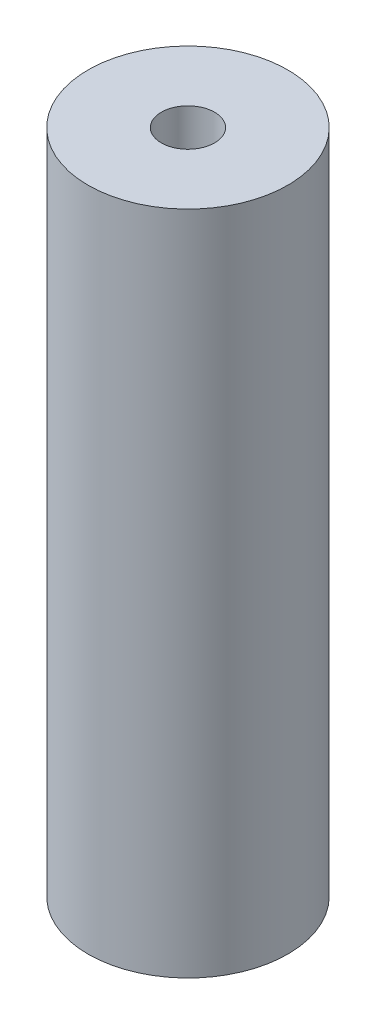
ISO-10303-21;
HEADER;
FILE_DESCRIPTION(('STEP AP214'),'2;1');
FILE_NAME('part.step','',(''),(''),'','','');
FILE_SCHEMA(('AUTOMOTIVE_DESIGN { 1 0 10303 214 1 1 1 1 }'));
ENDSEC;
DATA;
#1=APPLICATION_CONTEXT('core data for automotive mechanical design processes');
#2=APPLICATION_PROTOCOL_DEFINITION('international standard','automotive_design',2000,#1);
#3=PRODUCT_CONTEXT('',#1,'mechanical');
#4=PRODUCT('Part','Part','',(#3));
#5=PRODUCT_RELATED_PRODUCT_CATEGORY('part','',(#4));
#6=PRODUCT_DEFINITION_FORMATION('','',#4);
#7=PRODUCT_DEFINITION_CONTEXT('part definition',#1,'design');
#8=PRODUCT_DEFINITION('design','',#6,#7);
#9=PRODUCT_DEFINITION_SHAPE('','',#8);
#10=(LENGTH_UNIT() NAMED_UNIT(*) SI_UNIT(.MILLI.,.METRE.));
#11=(NAMED_UNIT(*) PLANE_ANGLE_UNIT() SI_UNIT($,.RADIAN.));
#12=(NAMED_UNIT(*) SI_UNIT($,.STERADIAN.) SOLID_ANGLE_UNIT());
#13=UNCERTAINTY_MEASURE_WITH_UNIT(LENGTH_MEASURE(1.E-05),#10,'distance_accuracy_value','');
#14=(GEOMETRIC_REPRESENTATION_CONTEXT(3) GLOBAL_UNCERTAINTY_ASSIGNED_CONTEXT((#13)) GLOBAL_UNIT_ASSIGNED_CONTEXT((#10,
#11,#12)) REPRESENTATION_CONTEXT('',''));
#15=CARTESIAN_POINT('',(0.,0.,0.));
#16=DIRECTION('',(0.,0.,1.));
#17=DIRECTION('',(1.,0.,0.));
#18=AXIS2_PLACEMENT_3D('',#15,#16,#17);
#19=CARTESIAN_POINT('',(0.,50.,0.));
#20=DIRECTION('',(0.,1.,0.));
#21=DIRECTION('',(0.,0.,1.));
#22=AXIS2_PLACEMENT_3D('',#19,#20,#21);
#23=PLANE('',#22);
#24=CARTESIAN_POINT('',(0.,50.,0.));
#25=DIRECTION('',(0.,1.,0.));
#26=DIRECTION('',(0.,0.,1.));
#27=AXIS2_PLACEMENT_3D('',#24,#25,#26);
#28=CIRCLE('',#27,7.5);
#29=CARTESIAN_POINT('',(0.,50.,7.5));
#30=VERTEX_POINT('',#29);
#31=EDGE_CURVE('E10',#30,#30,#28,.T.);
#32=ORIENTED_EDGE('',*,*,#31,.T.);
#33=EDGE_LOOP('',(#32));
#34=FACE_BOUND('',#33,.T.);
#35=CARTESIAN_POINT('',(0.,50.,0.));
#36=DIRECTION('',(0.,1.,0.));
#37=DIRECTION('',(0.,0.,1.));
#38=AXIS2_PLACEMENT_3D('',#35,#36,#37);
#39=CIRCLE('',#38,2.);
#40=CARTESIAN_POINT('',(0.,50.,2.));
#41=VERTEX_POINT('',#40);
#42=EDGE_CURVE('E44',#41,#41,#39,.T.);
#43=ORIENTED_EDGE('',*,*,#42,.F.);
#44=EDGE_LOOP('',(#43));
#45=FACE_BOUND('',#44,.T.);
#46=ADVANCED_FACE('F33',(#34,#45),#23,.T.);
#47=CARTESIAN_POINT('',(0.,0.,0.));
#48=DIRECTION('',(0.,1.,0.));
#49=DIRECTION('',(0.,0.,1.));
#50=AXIS2_PLACEMENT_3D('',#47,#48,#49);
#51=PLANE('',#50);
#52=CARTESIAN_POINT('',(0.,0.,0.));
#53=DIRECTION('',(0.,1.,0.));
#54=DIRECTION('',(0.,0.,1.));
#55=AXIS2_PLACEMENT_3D('',#52,#53,#54);
#56=CIRCLE('',#55,7.5);
#57=CARTESIAN_POINT('',(0.,0.,7.5));
#58=VERTEX_POINT('',#57);
#59=EDGE_CURVE('E37',#58,#58,#56,.T.);
#60=ORIENTED_EDGE('',*,*,#59,.F.);
#61=EDGE_LOOP('',(#60));
#62=FACE_BOUND('',#61,.T.);
#63=CARTESIAN_POINT('',(0.,0.,0.));
#64=DIRECTION('',(0.,1.,0.));
#65=DIRECTION('',(0.,0.,1.));
#66=AXIS2_PLACEMENT_3D('',#63,#64,#65);
#67=CIRCLE('',#66,2.);
#68=CARTESIAN_POINT('',(0.,0.,2.));
#69=VERTEX_POINT('',#68);
#70=EDGE_CURVE('E46',#69,#69,#67,.T.);
#71=ORIENTED_EDGE('',*,*,#70,.T.);
#72=EDGE_LOOP('',(#71));
#73=FACE_BOUND('',#72,.T.);
#74=ADVANCED_FACE('F56',(#62,#73),#51,.F.);
#75=CARTESIAN_POINT('',(0.,50.,0.));
#76=DIRECTION('',(0.,-1.,0.));
#77=DIRECTION('',(0.,0.,-1.));
#78=AXIS2_PLACEMENT_3D('',#75,#76,#77);
#79=CYLINDRICAL_SURFACE('',#78,7.5);
#80=ORIENTED_EDGE('',*,*,#31,.F.);
#81=EDGE_LOOP('',(#80));
#82=FACE_BOUND('',#81,.T.);
#83=ORIENTED_EDGE('',*,*,#59,.T.);
#84=EDGE_LOOP('',(#83));
#85=FACE_BOUND('',#84,.T.);
#86=ADVANCED_FACE('F35',(#82,#85),#79,.T.);
#87=CARTESIAN_POINT('',(0.,50.,0.));
#88=DIRECTION('',(0.,-1.,0.));
#89=DIRECTION('',(0.,0.,-1.));
#90=AXIS2_PLACEMENT_3D('',#87,#88,#89);
#91=CYLINDRICAL_SURFACE('',#90,2.);
#92=ORIENTED_EDGE('',*,*,#42,.T.);
#93=EDGE_LOOP('',(#92));
#94=FACE_BOUND('',#93,.T.);
#95=ORIENTED_EDGE('',*,*,#70,.F.);
#96=EDGE_LOOP('',(#95));
#97=FACE_BOUND('',#96,.T.);
#98=ADVANCED_FACE('F52',(#94,#97),#91,.F.);
#99=CLOSED_SHELL('',(#46,#74,#86,#98));
#100=MANIFOLD_SOLID_BREP('B2',#99);
#101=ADVANCED_BREP_SHAPE_REPRESENTATION('',(#18,#100),#14);
#102=SHAPE_DEFINITION_REPRESENTATION(#9,#101);
ENDSEC;
END-ISO-10303-21;
